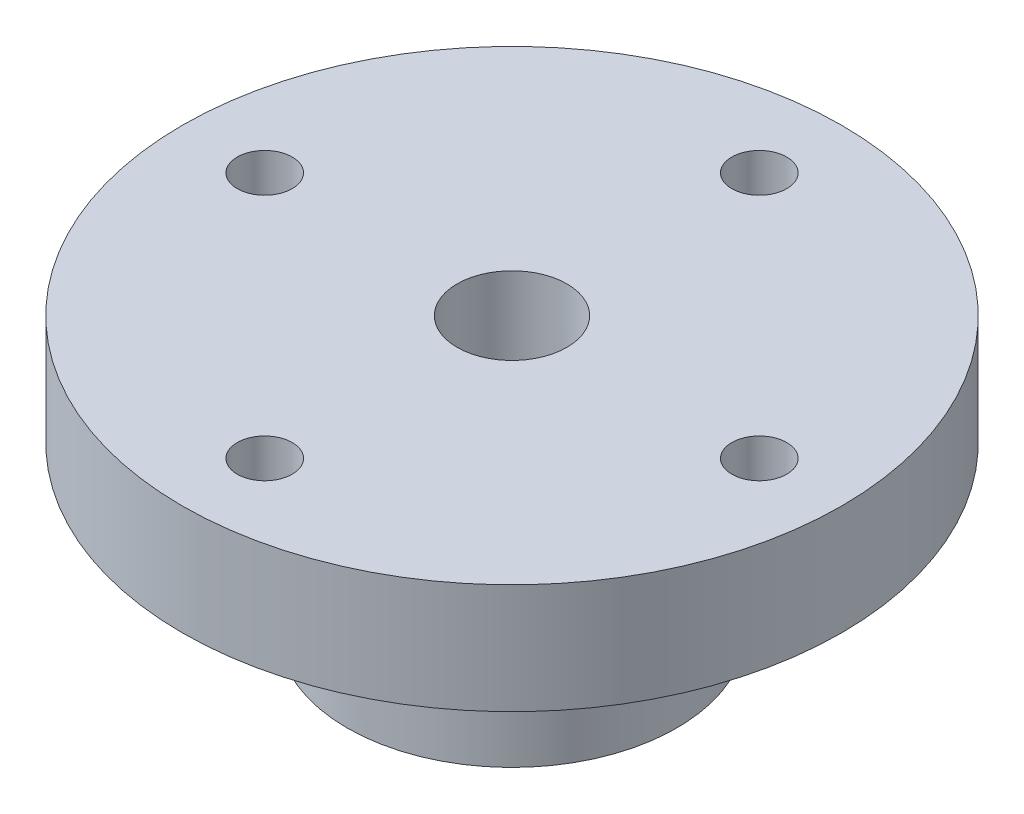
ISO-10303-21;
HEADER;
FILE_DESCRIPTION(('STEP AP214'),'2;1');
FILE_NAME('part.step','',(''),(''),'','','');
FILE_SCHEMA(('AUTOMOTIVE_DESIGN { 1 0 10303 214 1 1 1 1 }'));
ENDSEC;
DATA;
#1=APPLICATION_CONTEXT('core data for automotive mechanical design processes');
#2=APPLICATION_PROTOCOL_DEFINITION('international standard','automotive_design',2000,#1);
#3=PRODUCT_CONTEXT('',#1,'mechanical');
#4=PRODUCT('Part','Part','',(#3));
#5=PRODUCT_RELATED_PRODUCT_CATEGORY('part','',(#4));
#6=PRODUCT_DEFINITION_FORMATION('','',#4);
#7=PRODUCT_DEFINITION_CONTEXT('part definition',#1,'design');
#8=PRODUCT_DEFINITION('design','',#6,#7);
#9=PRODUCT_DEFINITION_SHAPE('','',#8);
#10=(LENGTH_UNIT() NAMED_UNIT(*) SI_UNIT(.MILLI.,.METRE.));
#11=(NAMED_UNIT(*) PLANE_ANGLE_UNIT() SI_UNIT($,.RADIAN.));
#12=(NAMED_UNIT(*) SI_UNIT($,.STERADIAN.) SOLID_ANGLE_UNIT());
#13=UNCERTAINTY_MEASURE_WITH_UNIT(LENGTH_MEASURE(1.E-05),#10,'distance_accuracy_value','');
#14=(GEOMETRIC_REPRESENTATION_CONTEXT(3) GLOBAL_UNCERTAINTY_ASSIGNED_CONTEXT((#13)) GLOBAL_UNIT_ASSIGNED_CONTEXT((#10,
#11,#12)) REPRESENTATION_CONTEXT('',''));
#15=CARTESIAN_POINT('',(0.,0.,0.));
#16=DIRECTION('',(0.,0.,1.));
#17=DIRECTION('',(1.,0.,0.));
#18=AXIS2_PLACEMENT_3D('',#15,#16,#17);
#19=CARTESIAN_POINT('',(0.,0.,0.));
#20=DIRECTION('',(0.,1.,0.));
#21=DIRECTION('',(0.,0.,1.));
#22=AXIS2_PLACEMENT_3D('',#19,#20,#21);
#23=PLANE('',#22);
#24=CARTESIAN_POINT('',(0.,0.,0.));
#25=DIRECTION('',(0.,1.,0.));
#26=DIRECTION('',(0.,0.,1.));
#27=AXIS2_PLACEMENT_3D('',#24,#25,#26);
#28=CIRCLE('',#27,30.);
#29=CARTESIAN_POINT('',(0.,0.,30.));
#30=VERTEX_POINT('',#29);
#31=EDGE_CURVE('E48',#30,#30,#28,.T.);
#32=ORIENTED_EDGE('',*,*,#31,.F.);
#33=EDGE_LOOP('',(#32));
#34=FACE_BOUND('',#33,.T.);
#35=CARTESIAN_POINT('',(0.,0.,-22.5));
#36=DIRECTION('',(0.,1.,0.));
#37=DIRECTION('',(0.,0.,1.));
#38=AXIS2_PLACEMENT_3D('',#35,#36,#37);
#39=CIRCLE('',#38,2.5);
#40=CARTESIAN_POINT('',(0.,0.,-20.));
#41=VERTEX_POINT('',#40);
#42=EDGE_CURVE('E101',#41,#41,#39,.T.);
#43=ORIENTED_EDGE('',*,*,#42,.T.);
#44=EDGE_LOOP('',(#43));
#45=FACE_BOUND('',#44,.T.);
#46=CARTESIAN_POINT('',(22.5000000000006,0.,-6.36733006886008E-13));
#47=DIRECTION('',(0.,1.,0.));
#48=DIRECTION('',(0.,0.,1.));
#49=AXIS2_PLACEMENT_3D('',#46,#47,#48);
#50=CIRCLE('',#49,2.5000000000005);
#51=CARTESIAN_POINT('',(22.5000000000006,0.,2.49999999999986));
#52=VERTEX_POINT('',#51);
#53=EDGE_CURVE('E105',#52,#52,#50,.T.);
#54=ORIENTED_EDGE('',*,*,#53,.T.);
#55=EDGE_LOOP('',(#54));
#56=FACE_BOUND('',#55,.T.);
#57=CARTESIAN_POINT('',(1.27346601377202E-12,0.,22.5));
#58=DIRECTION('',(0.,1.,0.));
#59=DIRECTION('',(0.,0.,1.));
#60=AXIS2_PLACEMENT_3D('',#57,#58,#59);
#61=CIRCLE('',#60,2.50000000000137);
#62=CARTESIAN_POINT('',(1.27346601377202E-12,0.,25.0000000000014));
#63=VERTEX_POINT('',#62);
#64=EDGE_CURVE('E109',#63,#63,#61,.T.);
#65=ORIENTED_EDGE('',*,*,#64,.T.);
#66=EDGE_LOOP('',(#65));
#67=FACE_BOUND('',#66,.T.);
#68=CARTESIAN_POINT('',(-22.4999999999994,0.,6.3948846218409E-13));
#69=DIRECTION('',(0.,1.,0.));
#70=DIRECTION('',(0.,0.,1.));
#71=AXIS2_PLACEMENT_3D('',#68,#69,#70);
#72=CIRCLE('',#71,2.50000000000102);
#73=CARTESIAN_POINT('',(-22.4999999999994,0.,2.50000000000166));
#74=VERTEX_POINT('',#73);
#75=EDGE_CURVE('E113',#74,#74,#72,.T.);
#76=ORIENTED_EDGE('',*,*,#75,.T.);
#77=EDGE_LOOP('',(#76));
#78=FACE_BOUND('',#77,.T.);
#79=CARTESIAN_POINT('',(0.,0.,0.));
#80=DIRECTION('',(0.,1.,0.));
#81=DIRECTION('',(0.,0.,1.));
#82=AXIS2_PLACEMENT_3D('',#79,#80,#81);
#83=CIRCLE('',#82,15.);
#84=CARTESIAN_POINT('',(0.,0.,15.));
#85=VERTEX_POINT('',#84);
#86=EDGE_CURVE('E10',#85,#85,#83,.F.);
#87=ORIENTED_EDGE('',*,*,#86,.F.);
#88=EDGE_LOOP('',(#87));
#89=FACE_BOUND('',#88,.T.);
#90=ADVANCED_FACE('F31',(#34,#45,#56,#67,#78,#89),#23,.F.);
#91=CARTESIAN_POINT('',(0.,10.,0.));
#92=DIRECTION('',(0.,1.,0.));
#93=DIRECTION('',(0.,0.,1.));
#94=AXIS2_PLACEMENT_3D('',#91,#92,#93);
#95=PLANE('',#94);
#96=CARTESIAN_POINT('',(-22.4999999999994,10.,6.3948846218409E-13));
#97=DIRECTION('',(0.,1.,0.));
#98=DIRECTION('',(0.,0.,1.));
#99=AXIS2_PLACEMENT_3D('',#96,#97,#98);
#100=CIRCLE('',#99,2.50000000000102);
#101=CARTESIAN_POINT('',(-22.4999999999994,10.,2.50000000000166));
#102=VERTEX_POINT('',#101);
#103=EDGE_CURVE('E116',#102,#102,#100,.T.);
#104=ORIENTED_EDGE('',*,*,#103,.F.);
#105=EDGE_LOOP('',(#104));
#106=FACE_BOUND('',#105,.T.);
#107=CARTESIAN_POINT('',(1.27346601377202E-12,10.,22.5));
#108=DIRECTION('',(0.,1.,0.));
#109=DIRECTION('',(0.,0.,1.));
#110=AXIS2_PLACEMENT_3D('',#107,#108,#109);
#111=CIRCLE('',#110,2.50000000000137);
#112=CARTESIAN_POINT('',(1.27346601377202E-12,10.,25.0000000000014));
#113=VERTEX_POINT('',#112);
#114=EDGE_CURVE('E115',#113,#113,#111,.T.);
#115=ORIENTED_EDGE('',*,*,#114,.F.);
#116=EDGE_LOOP('',(#115));
#117=FACE_BOUND('',#116,.T.);
#118=CARTESIAN_POINT('',(22.5000000000006,10.,-6.36733006886008E-13));
#119=DIRECTION('',(0.,1.,0.));
#120=DIRECTION('',(0.,0.,1.));
#121=AXIS2_PLACEMENT_3D('',#118,#119,#120);
#122=CIRCLE('',#121,2.5000000000005);
#123=CARTESIAN_POINT('',(22.5000000000006,10.,2.49999999999986));
#124=VERTEX_POINT('',#123);
#125=EDGE_CURVE('E125',#124,#124,#122,.T.);
#126=ORIENTED_EDGE('',*,*,#125,.F.);
#127=EDGE_LOOP('',(#126));
#128=FACE_BOUND('',#127,.T.);
#129=CARTESIAN_POINT('',(0.,10.,-22.5));
#130=DIRECTION('',(0.,1.,0.));
#131=DIRECTION('',(0.,0.,1.));
#132=AXIS2_PLACEMENT_3D('',#129,#130,#131);
#133=CIRCLE('',#132,2.5);
#134=CARTESIAN_POINT('',(0.,10.,-20.));
#135=VERTEX_POINT('',#134);
#136=EDGE_CURVE('E128',#135,#135,#133,.T.);
#137=ORIENTED_EDGE('',*,*,#136,.F.);
#138=EDGE_LOOP('',(#137));
#139=FACE_BOUND('',#138,.T.);
#140=CARTESIAN_POINT('',(0.,10.,0.));
#141=DIRECTION('',(0.,1.,0.));
#142=DIRECTION('',(0.,0.,1.));
#143=AXIS2_PLACEMENT_3D('',#140,#141,#142);
#144=CIRCLE('',#143,30.);
#145=CARTESIAN_POINT('',(0.,10.,30.));
#146=VERTEX_POINT('',#145);
#147=EDGE_CURVE('E43',#146,#146,#144,.T.);
#148=ORIENTED_EDGE('',*,*,#147,.T.);
#149=EDGE_LOOP('',(#148));
#150=FACE_BOUND('',#149,.T.);
#151=CARTESIAN_POINT('',(0.,10.,0.));
#152=DIRECTION('',(0.,1.,0.));
#153=DIRECTION('',(0.,0.,1.));
#154=AXIS2_PLACEMENT_3D('',#151,#152,#153);
#155=CIRCLE('',#154,5.);
#156=CARTESIAN_POINT('',(0.,10.,5.));
#157=VERTEX_POINT('',#156);
#158=EDGE_CURVE('E132',#157,#157,#155,.T.);
#159=ORIENTED_EDGE('',*,*,#158,.F.);
#160=EDGE_LOOP('',(#159));
#161=FACE_BOUND('',#160,.T.);
#162=ADVANCED_FACE('F87',(#106,#117,#128,#139,#150,#161),#95,.T.);
#163=CARTESIAN_POINT('',(0.,10.,0.));
#164=DIRECTION('',(0.,-1.,0.));
#165=DIRECTION('',(0.,0.,-1.));
#166=AXIS2_PLACEMENT_3D('',#163,#164,#165);
#167=CYLINDRICAL_SURFACE('',#166,30.);
#168=ORIENTED_EDGE('',*,*,#147,.F.);
#169=EDGE_LOOP('',(#168));
#170=FACE_BOUND('',#169,.T.);
#171=ORIENTED_EDGE('',*,*,#31,.T.);
#172=EDGE_LOOP('',(#171));
#173=FACE_BOUND('',#172,.T.);
#174=ADVANCED_FACE('F33',(#170,#173),#167,.T.);
#175=CARTESIAN_POINT('',(0.,10.,0.));
#176=DIRECTION('',(0.,-1.,0.));
#177=DIRECTION('',(0.,0.,-1.));
#178=AXIS2_PLACEMENT_3D('',#175,#176,#177);
#179=CYLINDRICAL_SURFACE('',#178,5.);
#180=CARTESIAN_POINT('',(0.,-5.,-5.));
#181=CARTESIAN_POINT('',(-0.131426682334305,-5.000009669056,-4.99999177550472));
#182=CARTESIAN_POINT('',(-0.263015634437213,-5.01042556177403,-4.99476199135277));
#183=CARTESIAN_POINT('',(-0.522301454622883,-5.05163182116205,-4.9743541856102));
#184=CARTESIAN_POINT('',(-0.649990448564105,-5.08246088092502,-4.9591572718767));
#185=CARTESIAN_POINT('',(-0.897333631316203,-5.16298462271884,-4.92040690922477));
#186=CARTESIAN_POINT('',(-1.01701694536277,-5.21260598778273,-4.89688595907259));
#187=CARTESIAN_POINT('',(-1.24618160399671,-5.32892652625179,-4.84364443325827));
#188=CARTESIAN_POINT('',(-1.3556637520377,-5.39562435314509,-4.81392434644421));
#189=CARTESIAN_POINT('',(-1.56876952630998,-5.54879313164263,-4.74890645050632));
#190=CARTESIAN_POINT('',(-1.67163802294308,-5.63621620022978,-4.71337997659091));
#191=CARTESIAN_POINT('',(-1.86194861703333,-5.82630369598529,-4.64149925776731));
#192=CARTESIAN_POINT('',(-1.94937895911555,-5.92897962884011,-4.60514440566897));
#193=CARTESIAN_POINT('',(-2.11312999967247,-6.15620837444528,-4.53247377945622));
#194=CARTESIAN_POINT('',(-2.18806333849064,-6.281840246035,-4.49637967412567));
#195=CARTESIAN_POINT('',(-2.31542056761491,-6.54591833979543,-4.43214946943555));
#196=CARTESIAN_POINT('',(-2.36786053751682,-6.68435532176262,-4.40400769020792));
#197=CARTESIAN_POINT('',(-2.44533110537653,-6.96166276359641,-4.36144667591402));
#198=CARTESIAN_POINT('',(-2.47181464267578,-7.10001113017958,-4.34630678958452));
#199=CARTESIAN_POINT('',(-2.50106748329741,-7.37994709443761,-4.3295472487215));
#200=CARTESIAN_POINT('',(-2.50386022093906,-7.52153135217509,-4.3279142335843));
#201=CARTESIAN_POINT('',(-2.48671821792512,-7.78571506079088,-4.33777325642937));
#202=CARTESIAN_POINT('',(-2.46946139884055,-7.90856007805828,-4.34771909154984));
#203=CARTESIAN_POINT('',(-2.41734962264384,-8.14930477343194,-4.37690571834675));
#204=CARTESIAN_POINT('',(-2.38248905974454,-8.26720286326311,-4.39614947079454));
#205=CARTESIAN_POINT('',(-2.29552445096459,-8.49807283141433,-4.44218691031839));
#206=CARTESIAN_POINT('',(-2.24303766778987,-8.61086599696452,-4.46914601659993));
#207=CARTESIAN_POINT('',(-2.12260421917012,-8.82658573147497,-4.52758510703513));
#208=CARTESIAN_POINT('',(-2.0546506095312,-8.92950783900021,-4.55906711950478));
#209=CARTESIAN_POINT('',(-1.89516513728194,-9.13630313185808,-4.62782894758213));
#210=CARTESIAN_POINT('',(-1.80173614592319,-9.2386421839404,-4.66533775591865));
#211=CARTESIAN_POINT('',(-1.59888894685344,-9.42683854647725,-4.73869058251019));
#212=CARTESIAN_POINT('',(-1.48946314143571,-9.5126879800847,-4.77453379897003));
#213=CARTESIAN_POINT('',(-1.25129126457962,-9.66921415257432,-4.84254968207409));
#214=CARTESIAN_POINT('',(-1.12188397899853,-9.73900118111435,-4.87447460405015));
#215=CARTESIAN_POINT('',(-0.851165538721985,-9.85524257260752,-4.92894702803109));
#216=CARTESIAN_POINT('',(-0.709863940663162,-9.9017154625379,-4.95150197358893));
#217=CARTESIAN_POINT('',(-0.431916229151781,-9.9661885092917,-4.98310834353579));
#218=CARTESIAN_POINT('',(-0.295853826370906,-9.986228089367,-4.9931234575324));
#219=CARTESIAN_POINT('',(-0.0219489998732886,-10.0036618278362,-5.00182533647794));
#220=CARTESIAN_POINT('',(0.115892549675109,-10.0010667140985,-5.00051746803426));
#221=CARTESIAN_POINT('',(0.378082429964657,-9.9744832789533,-4.98727980633468));
#222=CARTESIAN_POINT('',(0.502648520123707,-9.95216866817559,-4.97618114219992));
#223=CARTESIAN_POINT('',(0.746017230755973,-9.88940482026161,-4.94555428287529));
#224=CARTESIAN_POINT('',(0.864819214231884,-9.8489535838641,-4.92602515837625));
#225=CARTESIAN_POINT('',(1.09722152111965,-9.75000383391964,-4.87960628532329));
#226=CARTESIAN_POINT('',(1.21057599249831,-9.69102237471768,-4.85252204417873));
#227=CARTESIAN_POINT('',(1.42615340426439,-9.55723116087518,-4.7935993579975));
#228=CARTESIAN_POINT('',(1.52837157450204,-9.48241466348011,-4.76175888940534));
#229=CARTESIAN_POINT('',(1.72941922315487,-9.31059893670911,-4.69270553315087));
#230=CARTESIAN_POINT('',(1.82693019428496,-9.2121428290248,-4.65527212009488));
#231=CARTESIAN_POINT('',(2.0046408025722,-9.00018712195055,-4.58155978921587));
#232=CARTESIAN_POINT('',(2.08482846428685,-8.88667720293013,-4.54528168472407));
#233=CARTESIAN_POINT('',(2.22926978618995,-8.64089086451535,-4.4762798054528));
#234=CARTESIAN_POINT('',(2.29256373922243,-8.50797183470886,-4.44381323981254));
#235=CARTESIAN_POINT('',(2.39520706511459,-8.23122483111745,-4.38935180726746));
#236=CARTESIAN_POINT('',(2.43458729077055,-8.08741118400001,-4.36734345549014));
#237=CARTESIAN_POINT('',(2.48465421767005,-7.80772444263706,-4.33903752569351));
#238=CARTESIAN_POINT('',(2.4977324874436,-7.67241436588103,-4.33143458674096));
#239=CARTESIAN_POINT('',(2.50172288950898,-7.40138233261932,-4.32913386592579));
#240=CARTESIAN_POINT('',(2.49264462983266,-7.26566058012637,-4.3344304902511));
#241=CARTESIAN_POINT('',(2.45481530197332,-7.01129124438315,-4.35594655164663));
#242=CARTESIAN_POINT('',(2.42802074302696,-6.89224881827923,-4.37107736338133));
#243=CARTESIAN_POINT('',(2.35793843840544,-6.66047970780004,-4.40927540337602));
#244=CARTESIAN_POINT('',(2.31464538728732,-6.54775506843346,-4.43234518434965));
#245=CARTESIAN_POINT('',(2.20953919315538,-6.32343784728027,-4.48571326433413));
#246=CARTESIAN_POINT('',(2.14667719009403,-6.21243014826498,-4.5163930799845));
#247=CARTESIAN_POINT('',(2.0053780838799,-6.00181375675995,-4.58088327077455));
#248=CARTESIAN_POINT('',(1.92693287765888,-5.90221103737127,-4.61469526970767));
#249=CARTESIAN_POINT('',(1.74550556946066,-5.70464463625036,-4.68655816327011));
#250=CARTESIAN_POINT('',(1.6407002246921,-5.60835063582862,-4.7246249151498));
#251=CARTESIAN_POINT('',(1.41539785420684,-5.43434415057195,-4.79694347383545));
#252=CARTESIAN_POINT('',(1.29489242426332,-5.35664168139412,-4.83119321905446));
#253=CARTESIAN_POINT('',(1.03978808878536,-5.2219030205159,-4.89245149457782));
#254=CARTESIAN_POINT('',(0.905095560782288,-5.16501683221555,-4.91940711437488));
#255=CARTESIAN_POINT('',(0.696328709257352,-5.0978161412076,-4.95177960923351));
#256=CARTESIAN_POINT('',(0.625670413494088,-5.07844460199819,-4.96122314081874));
#257=CARTESIAN_POINT('',(0.482623997839257,-5.0459340516294,-4.97717127275101));
#258=CARTESIAN_POINT('',(0.410236963092401,-5.03279123332365,-4.98367766823159));
#259=CARTESIAN_POINT('',(0.281518684621671,-5.01526252771536,-4.9923820076613));
#260=CARTESIAN_POINT('',(0.225408499555445,-5.00954506346867,-4.99523288466454));
#261=CARTESIAN_POINT('',(0.112875528456289,-5.00191167053429,-4.99904367329659));
#262=CARTESIAN_POINT('',(0.056452733838218,-4.99999584677452,-5.00000353273198));
#263=CARTESIAN_POINT('',(0.,-5.,-5.));
#264=B_SPLINE_CURVE_WITH_KNOTS('',3,(#180,#181,#182,#183,#184,#185,#186,#187,#188,#189,#190,
#191,#192,#193,#194,#195,#196,#197,#198,#199,#200,#201,#202,#203,#204,#205,#206,#207,#208,#209,
#210,#211,#212,#213,#214,#215,#216,#217,#218,#219,#220,#221,#222,#223,#224,#225,#226,#227,#228,
#229,#230,#231,#232,#233,#234,#235,#236,#237,#238,#239,#240,#241,#242,#243,#244,#245,#246,#247,
#248,#249,#250,#251,#252,#253,#254,#255,#256,#257,#258,#259,#260,#261,#262,#263),.UNSPECIFIED.,
.T.,.F.,(4,2,2,2,2,2,2,2,2,2,2,2,2,2,2,2,2,2,2,2,2,2,2,2,2,2,2,2,2,2,2,2,2,2,2,2,2,2,2,2,2,4),
(0.,0.394060643550731,0.788870374272994,1.18215538873075,1.57540940145392,1.99245439679522,
2.40981559413509,2.85954316076882,3.30894869745702,3.73145030350574,4.15353393322551,
4.52514281023301,4.89687009814196,5.27725600421219,5.65781303150555,6.08662353334696,
6.51563836496716,6.96457555536102,7.41315542280699,7.82458226178364,8.2358141127869,
8.61517266265305,8.99457304077329,9.38482140069747,9.77523626870848,10.2039902661037,
10.6330397153795,11.0828670540368,11.53211279863,11.9382326875699,12.3441764966107,
12.7114482562151,13.0788382197025,13.4709114195009,13.8631890285845,14.303131068923,
14.7433095845248,15.1866003415819,15.407934939208,15.6291340766843,15.7983933645035,
15.9676573239323),.UNSPECIFIED.);
#265=CARTESIAN_POINT('',(0.,-5.,-5.));
#266=VERTEX_POINT('',#265);
#267=EDGE_CURVE('E75',#266,#266,#264,.T.);
#268=ORIENTED_EDGE('',*,*,#267,.F.);
#269=EDGE_LOOP('',(#268));
#270=FACE_BOUND('',#269,.T.);
#271=CARTESIAN_POINT('',(2.5,-7.5,4.33012701892219));
#272=CARTESIAN_POINT('',(2.49998948436432,-7.63026650687649,4.33013982272992));
#273=CARTESIAN_POINT('',(2.48974954513168,-7.76070272067625,4.33609541965583));
#274=CARTESIAN_POINT('',(2.44930840724943,-8.01756897152923,4.35905877051907));
#275=CARTESIAN_POINT('',(2.41906526369545,-8.14399000405729,4.37608974726023));
#276=CARTESIAN_POINT('',(2.3402497699757,-8.38862894556106,4.41873376871659));
#277=CARTESIAN_POINT('',(2.29177485369963,-8.50688657356221,4.44430111338921));
#278=CARTESIAN_POINT('',(2.17816884056414,-8.73356056309455,4.50106659111456));
#279=CARTESIAN_POINT('',(2.11303684262671,-8.84197639179579,4.53226502875883));
#280=CARTESIAN_POINT('',(1.96166634317253,-9.05576430391693,4.59992173524851));
#281=CARTESIAN_POINT('',(1.87413008816917,-9.16014783448977,4.63660159331578));
#282=CARTESIAN_POINT('',(1.68313452122751,-9.3535209757132,4.70929956727453));
#283=CARTESIAN_POINT('',(1.57966731506051,-9.44250290775495,4.74531734512768));
#284=CARTESIAN_POINT('',(1.35122390789082,-9.60841787648564,4.81553692452135));
#285=CARTESIAN_POINT('',(1.22526797235894,-9.68413441927914,4.84945266064072));
#286=CARTESIAN_POINT('',(0.960392566671145,-9.81285213348386,4.90876890230193));
#287=CARTESIAN_POINT('',(0.821481345389981,-9.8658676404385,4.93417477954535));
#288=CARTESIAN_POINT('',(0.545112359773522,-9.94376165316397,4.9720115311507));
#289=CARTESIAN_POINT('',(0.408254476210982,-9.97037381586513,4.98523700553425));
#290=CARTESIAN_POINT('',(0.131426571755676,-10.0004152967113,5.00018959613973));
#291=CARTESIAN_POINT('',(-0.00854151460650898,-10.0038586419954,5.00192366961168));
#292=CARTESIAN_POINT('',(-0.274581311061965,-9.98813331506857,4.99407454791405));
#293=CARTESIAN_POINT('',(-0.400802997942673,-9.97090496119545,4.98546239730476));
#294=CARTESIAN_POINT('',(-0.648284429795111,-9.91779789023984,4.95935613149294));
#295=CARTESIAN_POINT('',(-0.769543802734626,-9.88191777755984,4.94186135165964));
#296=CARTESIAN_POINT('',(-1.00577347892407,-9.79229358477506,4.89928958219156));
#297=CARTESIAN_POINT('',(-1.120633558788,-9.73830921706972,4.87411103823003));
#298=CARTESIAN_POINT('',(-1.33994200378327,-9.61434145949637,4.81844114966712));
#299=CARTESIAN_POINT('',(-1.4443866220966,-9.54435234174415,4.78794790393709));
#300=CARTESIAN_POINT('',(-1.6504341522455,-9.38276162116743,4.72110985998074));
#301=CARTESIAN_POINT('',(-1.75083518757341,-9.28974242918496,4.68448439995438));
#302=CARTESIAN_POINT('',(-1.93526092574445,-9.08852568767457,4.61135851467029));
#303=CARTESIAN_POINT('',(-2.01927302893558,-8.98031656931484,4.57485820664072));
#304=CARTESIAN_POINT('',(-2.17376333660553,-8.74337951893978,4.50360390231212));
#305=CARTESIAN_POINT('',(-2.24304328744513,-8.61378494236447,4.46910799976769));
#306=CARTESIAN_POINT('',(-2.35829778250308,-8.34265582160251,4.4093862569644));
#307=CARTESIAN_POINT('',(-2.40429664552722,-8.20113391745609,4.38415075115168));
#308=CARTESIAN_POINT('',(-2.4679505275626,-7.92196372179302,4.34861589542586));
#309=CARTESIAN_POINT('',(-2.48756280529994,-7.78489720239113,4.33729139621241));
#310=CARTESIAN_POINT('',(-2.50379236652857,-7.50899664620864,4.32794798404024));
#311=CARTESIAN_POINT('',(-2.50042589328757,-7.3701639272005,4.32991967223279));
#312=CARTESIAN_POINT('',(-2.47259010835991,-7.1108652035532,4.34585841351462));
#313=CARTESIAN_POINT('',(-2.45046954178116,-6.99005137223027,4.35848968766635));
#314=CARTESIAN_POINT('',(-2.38924071158112,-6.75408053432251,4.39235053878353));
#315=CARTESIAN_POINT('',(-2.35012694655908,-6.63892537313315,4.41358290012585));
#316=CARTESIAN_POINT('',(-2.25411897151217,-6.4114716727436,4.46340555199141));
#317=CARTESIAN_POINT('',(-2.19648515923162,-6.29955245786743,4.49229108107657));
#318=CARTESIAN_POINT('',(-2.0657176600397,-6.0863268211512,4.55390298743125));
#319=CARTESIAN_POINT('',(-1.99257601083123,-5.98502589121186,4.58663133387872));
#320=CARTESIAN_POINT('',(-1.82209291799636,-5.78255308119668,4.65719996140836));
#321=CARTESIAN_POINT('',(-1.72286318078435,-5.68300712322778,4.69516457885708));
#322=CARTESIAN_POINT('',(-1.5085112384988,-5.50146940499409,4.76835587444746));
#323=CARTESIAN_POINT('',(-1.39338368664988,-5.41948357434145,4.80358162519329));
#324=CARTESIAN_POINT('',(-1.14633840638507,-5.27356568520911,4.86853404227334));
#325=CARTESIAN_POINT('',(-1.01405774389062,-5.21016720479154,4.89809104179855));
#326=CARTESIAN_POINT('',(-0.738805911647332,-5.10715524003798,4.9470838739847));
#327=CARTESIAN_POINT('',(-0.595844253647067,-5.06752087039488,4.96652859191746));
#328=CARTESIAN_POINT('',(-0.317449205674705,-5.01657859064358,4.99168770453968));
#329=CARTESIAN_POINT('',(-0.182528609085376,-5.00300531416965,4.99849819767838));
#330=CARTESIAN_POINT('',(0.0878149643374312,-4.99789183250541,5.00105325940467));
#331=CARTESIAN_POINT('',(0.223237748727017,-5.00634391433891,4.99680170177042));
#332=CARTESIAN_POINT('',(0.481344982671073,-5.0435410303955,4.97834922085637));
#333=CARTESIAN_POINT('',(0.604280801321772,-5.07091217163631,4.96482236636807));
#334=CARTESIAN_POINT('',(0.843614873664455,-5.14331744975833,4.92980234191731));
#335=CARTESIAN_POINT('',(0.960012187087214,-5.18835411963363,4.90830802955518));
#336=CARTESIAN_POINT('',(1.18855854199593,-5.29681781873926,4.85814826741488));
#337=CARTESIAN_POINT('',(1.30031295715363,-5.36094902468984,4.82921542506803));
#338=CARTESIAN_POINT('',(1.51193650408535,-5.50489411014759,4.76720333344986));
#339=CARTESIAN_POINT('',(1.61180014305397,-5.58471519262687,4.73412218229104));
#340=CARTESIAN_POINT('',(1.8072854232437,-5.76699579444936,4.66321523550925));
#341=CARTESIAN_POINT('',(1.90149582349002,-5.87091772600073,4.62524489658367));
#342=CARTESIAN_POINT('',(2.07165660492503,-6.09361528538223,4.55157698284941));
#343=CARTESIAN_POINT('',(2.1475908315154,-6.21240391419923,4.51588143910584));
#344=CARTESIAN_POINT('',(2.28108393396028,-6.46663611766426,4.44998982823926));
#345=CARTESIAN_POINT('',(2.3379862797745,-6.6024873884246,4.42000320346984));
#346=CARTESIAN_POINT('',(2.40494911880459,-6.81322264951977,4.38370272660093));
#347=CARTESIAN_POINT('',(2.42419582683991,-6.88455977569761,4.37305486646054));
#348=CARTESIAN_POINT('',(2.45635087255789,-7.02904069684933,4.35507574170935));
#349=CARTESIAN_POINT('',(2.46926364179176,-7.10218319095441,4.34774215854234));
#350=CARTESIAN_POINT('',(2.48591166201423,-7.22950098654694,4.3382377954292));
#351=CARTESIAN_POINT('',(2.49118864979202,-7.2834163215122,4.33520487024791));
#352=CARTESIAN_POINT('',(2.49823512543933,-7.3915446163104,4.33114674911323));
#353=CARTESIAN_POINT('',(2.50000437866474,-7.44575759581055,4.33012168747261));
#354=CARTESIAN_POINT('',(2.5,-7.5,4.33012701892219));
#355=B_SPLINE_CURVE_WITH_KNOTS('',3,(#271,#272,#273,#274,#275,#276,#277,#278,#279,#280,#281,
#282,#283,#284,#285,#286,#287,#288,#289,#290,#291,#292,#293,#294,#295,#296,#297,#298,#299,#300,
#301,#302,#303,#304,#305,#306,#307,#308,#309,#310,#311,#312,#313,#314,#315,#316,#317,#318,#319,
#320,#321,#322,#323,#324,#325,#326,#327,#328,#329,#330,#331,#332,#333,#334,#335,#336,#337,#338,
#339,#340,#341,#342,#343,#344,#345,#346,#347,#348,#349,#350,#351,#352,#353,#354),.UNSPECIFIED.,
.T.,.F.,(4,2,2,2,2,2,2,2,2,2,2,2,2,2,2,2,2,2,2,2,2,2,2,2,2,2,2,2,2,2,2,2,2,2,2,2,2,2,2,2,2,4),
(0.,0.39058030648679,0.781982232062012,1.17132148982692,1.56068181366371,1.98215578129642,
2.40383927716011,2.85394730601992,3.30377067414811,3.72158712424921,4.13915059220183,
4.52040243716429,4.90168281298721,5.2882383683295,5.67493248380763,6.0981797864731,
6.5217512061988,6.97222104328704,7.42221935534345,7.83655727140613,8.25060232976016,
8.61935458565147,8.98822631095241,9.37418241020302,9.76033715555202,10.1951685895662,
10.6301466245059,11.076604535375,11.5226694952701,11.927806759788,12.3328021699001,
12.7111106218381,13.0894733378512,13.4840187680376,13.8787457525688,14.3127560463025,
14.7471485711797,15.195268726016,15.4189244153949,15.6424233996907,15.8050484542806,
15.9676843870379),.UNSPECIFIED.);
#356=CARTESIAN_POINT('',(2.5,-7.5,4.33012701892219));
#357=VERTEX_POINT('',#356);
#358=EDGE_CURVE('E70',#357,#357,#355,.T.);
#359=ORIENTED_EDGE('',*,*,#358,.F.);
#360=EDGE_LOOP('',(#359));
#361=FACE_BOUND('',#360,.T.);
#362=ORIENTED_EDGE('',*,*,#158,.T.);
#363=EDGE_LOOP('',(#362));
#364=FACE_BOUND('',#363,.T.);
#365=CARTESIAN_POINT('',(0.,-15.,0.));
#366=DIRECTION('',(0.,-1.,0.));
#367=DIRECTION('',(0.,0.,-1.));
#368=AXIS2_PLACEMENT_3D('',#365,#366,#367);
#369=CIRCLE('',#368,5.);
#370=CARTESIAN_POINT('',(0.,-15.,-5.));
#371=VERTEX_POINT('',#370);
#372=EDGE_CURVE('E243',#371,#371,#369,.T.);
#373=ORIENTED_EDGE('',*,*,#372,.T.);
#374=EDGE_LOOP('',(#373));
#375=FACE_BOUND('',#374,.T.);
#376=ADVANCED_FACE('F79',(#270,#361,#364,#375),#179,.F.);
#377=CARTESIAN_POINT('',(0.,0.,-22.5));
#378=DIRECTION('',(0.,1.,0.));
#379=DIRECTION('',(0.,0.,1.));
#380=AXIS2_PLACEMENT_3D('',#377,#378,#379);
#381=CYLINDRICAL_SURFACE('',#380,2.5);
#382=ORIENTED_EDGE('',*,*,#42,.F.);
#383=EDGE_LOOP('',(#382));
#384=FACE_BOUND('',#383,.T.);
#385=ORIENTED_EDGE('',*,*,#136,.T.);
#386=EDGE_LOOP('',(#385));
#387=FACE_BOUND('',#386,.T.);
#388=ADVANCED_FACE('F84',(#384,#387),#381,.F.);
#389=CARTESIAN_POINT('',(22.5000000000006,0.,-6.36733006886008E-13));
#390=DIRECTION('',(0.,1.,0.));
#391=DIRECTION('',(0.,0.,1.));
#392=AXIS2_PLACEMENT_3D('',#389,#390,#391);
#393=CYLINDRICAL_SURFACE('',#392,2.5000000000005);
#394=ORIENTED_EDGE('',*,*,#53,.F.);
#395=EDGE_LOOP('',(#394));
#396=FACE_BOUND('',#395,.T.);
#397=ORIENTED_EDGE('',*,*,#125,.T.);
#398=EDGE_LOOP('',(#397));
#399=FACE_BOUND('',#398,.T.);
#400=ADVANCED_FACE('F160',(#396,#399),#393,.F.);
#401=CARTESIAN_POINT('',(1.27346601377202E-12,0.,22.5));
#402=DIRECTION('',(0.,1.,0.));
#403=DIRECTION('',(0.,0.,1.));
#404=AXIS2_PLACEMENT_3D('',#401,#402,#403);
#405=CYLINDRICAL_SURFACE('',#404,2.50000000000137);
#406=ORIENTED_EDGE('',*,*,#64,.F.);
#407=EDGE_LOOP('',(#406));
#408=FACE_BOUND('',#407,.T.);
#409=ORIENTED_EDGE('',*,*,#114,.T.);
#410=EDGE_LOOP('',(#409));
#411=FACE_BOUND('',#410,.T.);
#412=ADVANCED_FACE('F167',(#408,#411),#405,.F.);
#413=CARTESIAN_POINT('',(-22.4999999999994,0.,6.3948846218409E-13));
#414=DIRECTION('',(0.,1.,0.));
#415=DIRECTION('',(0.,0.,1.));
#416=AXIS2_PLACEMENT_3D('',#413,#414,#415);
#417=CYLINDRICAL_SURFACE('',#416,2.50000000000102);
#418=ORIENTED_EDGE('',*,*,#75,.F.);
#419=EDGE_LOOP('',(#418));
#420=FACE_BOUND('',#419,.T.);
#421=ORIENTED_EDGE('',*,*,#103,.T.);
#422=EDGE_LOOP('',(#421));
#423=FACE_BOUND('',#422,.T.);
#424=ADVANCED_FACE('F174',(#420,#423),#417,.F.);
#425=CARTESIAN_POINT('',(0.,-15.,0.));
#426=DIRECTION('',(0.,-1.,0.));
#427=DIRECTION('',(0.,0.,-1.));
#428=AXIS2_PLACEMENT_3D('',#425,#426,#427);
#429=PLANE('',#428);
#430=CARTESIAN_POINT('',(0.,-15.,0.));
#431=DIRECTION('',(0.,-1.,0.));
#432=DIRECTION('',(0.,0.,-1.));
#433=AXIS2_PLACEMENT_3D('',#430,#431,#432);
#434=CIRCLE('',#433,15.);
#435=CARTESIAN_POINT('',(0.,-15.,-15.));
#436=VERTEX_POINT('',#435);
#437=EDGE_CURVE('E121',#436,#436,#434,.T.);
#438=ORIENTED_EDGE('',*,*,#437,.T.);
#439=EDGE_LOOP('',(#438));
#440=FACE_BOUND('',#439,.T.);
#441=ORIENTED_EDGE('',*,*,#372,.F.);
#442=EDGE_LOOP('',(#441));
#443=FACE_BOUND('',#442,.T.);
#444=ADVANCED_FACE('F64',(#440,#443),#429,.T.);
#445=CARTESIAN_POINT('',(0.,-15.,0.));
#446=DIRECTION('',(0.,1.,0.));
#447=DIRECTION('',(0.,0.,1.));
#448=AXIS2_PLACEMENT_3D('',#445,#446,#447);
#449=CYLINDRICAL_SURFACE('',#448,15.);
#450=CARTESIAN_POINT('',(0.,-10.,15.));
#451=CARTESIAN_POINT('',(-0.139390904958215,-9.99999441105218,14.9999976116882));
#452=CARTESIAN_POINT('',(-0.278857881838821,-9.98830272503108,14.9980367791303));
#453=CARTESIAN_POINT('',(-0.553880221673043,-9.94186434123467,14.9904034494139));
#454=CARTESIAN_POINT('',(-0.689431867959247,-9.9070964430884,14.9847275392389));
#455=CARTESIAN_POINT('',(-0.952604747212644,-9.81558455140724,14.9703006823645));
#456=CARTESIAN_POINT('',(-1.0802323684319,-9.75885853435942,14.9615522515919));
#457=CARTESIAN_POINT('',(-1.32414184197794,-9.6250877079476,14.9419422708207));
#458=CARTESIAN_POINT('',(-1.44042498987859,-9.548045222517,14.9310809625443));
#459=CARTESIAN_POINT('',(-1.65947261429168,-9.37504491617954,14.9083331745831));
#460=CARTESIAN_POINT('',(-1.76211290353497,-9.27893088536387,14.8964387181486));
#461=CARTESIAN_POINT('',(-1.94988849865993,-9.07085203152719,14.8730262687673));
#462=CARTESIAN_POINT('',(-2.03502269939097,-8.95888620854339,14.8615082996267));
#463=CARTESIAN_POINT('',(-2.18586712560513,-8.72142903380294,14.8400756575978));
#464=CARTESIAN_POINT('',(-2.251454552861,-8.59585866319524,14.8301712909164));
#465=CARTESIAN_POINT('',(-2.36055836541122,-8.33529043569937,14.8131978979467));
#466=CARTESIAN_POINT('',(-2.40407624156561,-8.20029321632236,14.8061286801431));
#467=CARTESIAN_POINT('',(-2.46741437778481,-7.92601972514346,14.7957053684276));
#468=CARTESIAN_POINT('',(-2.4874490291354,-7.78679426349861,14.792317684857));
#469=CARTESIAN_POINT('',(-2.50391672528988,-7.50691972311653,14.7895393893665));
#470=CARTESIAN_POINT('',(-2.500351440389,-7.3662707458327,14.7901484945721));
#471=CARTESIAN_POINT('',(-2.46989509839615,-7.08907213872455,14.7952642886355));
#472=CARTESIAN_POINT('',(-2.44324488188977,-6.95249519645476,14.7997307331892));
#473=CARTESIAN_POINT('',(-2.36775314040345,-6.68577868217086,14.8119949521101));
#474=CARTESIAN_POINT('',(-2.31891085431974,-6.55563933111145,14.8197928407327));
#475=CARTESIAN_POINT('',(-2.20017724609391,-6.30477117655908,14.837884793341));
#476=CARTESIAN_POINT('',(-2.13018591387971,-6.18409059391877,14.8481906710733));
#477=CARTESIAN_POINT('',(-1.97121201755743,-5.95609559946161,14.8701291841501));
#478=CARTESIAN_POINT('',(-1.88222792065429,-5.84878226754507,14.8817619265429));
#479=CARTESIAN_POINT('',(-1.68648221215905,-5.64917391419265,14.9052202787979));
#480=CARTESIAN_POINT('',(-1.57951396387313,-5.55708148145992,14.9170464923165));
#481=CARTESIAN_POINT('',(-1.35153524898165,-5.39212223733466,14.9394260139672));
#482=CARTESIAN_POINT('',(-1.23052469190642,-5.31925554981677,14.9499793138975));
#483=CARTESIAN_POINT('',(-0.977705916166712,-5.19479777286371,14.9686389289291));
#484=CARTESIAN_POINT('',(-0.845888725564662,-5.14322458066874,14.9767431840745));
#485=CARTESIAN_POINT('',(-0.575298345602731,-5.06300578475402,14.9895750301266));
#486=CARTESIAN_POINT('',(-0.436525739179468,-5.03435826302628,14.9943029035047));
#487=CARTESIAN_POINT('',(-0.157709901301624,-5.00107864153886,14.9998112984269));
#488=CARTESIAN_POINT('',(-0.0177007371510114,-4.99616842819439,15.0006375301278));
#489=CARTESIAN_POINT('',(0.261139772889887,-5.00976134442812,14.9983747442117));
#490=CARTESIAN_POINT('',(0.399971163892039,-5.02826357313373,14.9952858772412));
#491=CARTESIAN_POINT('',(0.671656175546763,-5.08792484933547,14.985568269382));
#492=CARTESIAN_POINT('',(0.804540868385379,-5.12894620839012,14.9789610480131));
#493=CARTESIAN_POINT('',(1.06154688486044,-5.23233451819953,14.9629446445536));
#494=CARTESIAN_POINT('',(1.18566771590972,-5.29470266763527,14.9535353051202));
#495=CARTESIAN_POINT('',(1.42283068946896,-5.43965112469678,14.9328451630241));
#496=CARTESIAN_POINT('',(1.53576525093715,-5.52240515616725,14.9215485588702));
#497=CARTESIAN_POINT('',(1.74624358550269,-5.70553731538506,14.898384673919));
#498=CARTESIAN_POINT('',(1.84378623969658,-5.80591672327667,14.8865173517155));
#499=CARTESIAN_POINT('',(2.021742779658,-6.02269754807142,14.8634017523585));
#500=CARTESIAN_POINT('',(2.10196876111372,-6.13925416551441,14.8521611613711));
#501=CARTESIAN_POINT('',(2.24170231029499,-6.38435296913854,14.8317152977788));
#502=CARTESIAN_POINT('',(2.30121053476982,-6.51289477522749,14.8225099606602));
#503=CARTESIAN_POINT('',(2.39753833147315,-6.77778973281213,14.807234536977));
#504=CARTESIAN_POINT('',(2.43445143254795,-6.91410809503049,14.8011515431106));
#505=CARTESIAN_POINT('',(2.48483545377828,-7.19112012922176,14.7927771683526));
#506=CARTESIAN_POINT('',(2.49830841194617,-7.33181341973205,14.7904854578272));
#507=CARTESIAN_POINT('',(2.50137286604735,-7.61170516596241,14.7899673308401));
#508=CARTESIAN_POINT('',(2.49126013612519,-7.75090037857529,14.7916905650565));
#509=CARTESIAN_POINT('',(2.44807983895685,-8.02557924805076,14.7988978145373));
#510=CARTESIAN_POINT('',(2.41501234611248,-8.16106291694187,14.8043818176121));
#511=CARTESIAN_POINT('',(2.3269744895949,-8.42435843729261,14.8184735628172));
#512=CARTESIAN_POINT('',(2.27202959060044,-8.55217901005602,14.8270776721967));
#513=CARTESIAN_POINT('',(2.14182700391591,-8.79683566919485,14.8464436892221));
#514=CARTESIAN_POINT('',(2.06656830874856,-8.91367121037213,14.857205703884));
#515=CARTESIAN_POINT('',(1.89681888437215,-9.13453558310775,14.8798345404562));
#516=CARTESIAN_POINT('',(1.80211056359365,-9.23839601670027,14.891712955763));
#517=CARTESIAN_POINT('',(1.59660903138023,-9.42885160447494,14.9151437236084));
#518=CARTESIAN_POINT('',(1.48581211291263,-9.51544276863817,14.9266960002655));
#519=CARTESIAN_POINT('',(1.25036916964028,-9.66944826819994,14.9482652964222));
#520=CARTESIAN_POINT('',(1.12563278753282,-9.73672603931295,14.958271162531));
#521=CARTESIAN_POINT('',(0.866513069378981,-9.84926948460992,14.9755116760178));
#522=CARTESIAN_POINT('',(0.732139494830009,-9.8945570810797,14.9827490817748));
#523=CARTESIAN_POINT('',(0.4977033100454,-9.95200527412666,14.9920579083296));
#524=CARTESIAN_POINT('',(0.399058830298447,-9.96997446961596,14.9950202727336));
#525=CARTESIAN_POINT('',(0.200289310319809,-9.99397373784475,14.9989921598612));
#526=CARTESIAN_POINT('',(0.100164295608494,-10.0000040161374,15.0000017162064));
#527=CARTESIAN_POINT('',(0.,-10.,15.));
#528=B_SPLINE_CURVE_WITH_KNOTS('',3,(#450,#451,#452,#453,#454,#455,#456,#457,#458,#459,#460,
#461,#462,#463,#464,#465,#466,#467,#468,#469,#470,#471,#472,#473,#474,#475,#476,#477,#478,#479,
#480,#481,#482,#483,#484,#485,#486,#487,#488,#489,#490,#491,#492,#493,#494,#495,#496,#497,#498,
#499,#500,#501,#502,#503,#504,#505,#506,#507,#508,#509,#510,#511,#512,#513,#514,#515,#516,#517,
#518,#519,#520,#521,#522,#523,#524,#525,#526,#527),.UNSPECIFIED.,.T.,.F.,(4,2,2,2,2,2,2,2,2,2,2,
2,2,2,2,2,2,2,2,2,2,2,2,2,2,2,2,2,2,2,2,2,2,2,2,2,2,2,4),(0.,0.41780658493851,0.835997545695421,
1.25384686702527,1.67164841267479,2.09302491062332,2.51442800169857,2.9384252082384,
3.36239376876181,3.78246077103424,4.20249804320886,4.61820521760409,5.03392665025381,
5.45164556632558,5.86939820680574,6.29232769911327,6.71525991635848,7.13854688915903,
7.56179844521149,7.98007883491397,8.3983431303586,8.81407807006415,9.22983635826066,
9.64926825627024,10.0687306305428,10.4925382200762,10.9163323737594,11.3383602234177,
11.7603513778662,12.177079095227,12.5938054618813,13.0100481822622,13.4263115502934,
13.8475138419339,14.2688133387897,14.693022316072,15.1168075213007,15.4170424816402,
15.7172722727697),.UNSPECIFIED.);
#529=CARTESIAN_POINT('',(0.,-10.,15.));
#530=VERTEX_POINT('',#529);
#531=EDGE_CURVE('E35',#530,#530,#528,.T.);
#532=ORIENTED_EDGE('',*,*,#531,.T.);
#533=EDGE_LOOP('',(#532));
#534=FACE_BOUND('',#533,.T.);
#535=CARTESIAN_POINT('',(2.5,-7.5,-14.790199457749));
#536=CARTESIAN_POINT('',(2.49999439841983,-7.36062425183819,-14.790201973666));
#537=CARTESIAN_POINT('',(2.48830516902828,-7.22117239392853,-14.7921909238523));
#538=CARTESIAN_POINT('',(2.44187742806638,-6.94618145673683,-14.7999245720004));
#539=CARTESIAN_POINT('',(2.40711766030861,-6.81064610624193,-14.8056727334637));
#540=CARTESIAN_POINT('',(2.31562954367049,-6.54750771665839,-14.8202560936731));
#541=CARTESIAN_POINT('',(2.25891955493199,-6.41989815133775,-14.8290887118401));
#542=CARTESIAN_POINT('',(2.12518649688947,-6.17601904528222,-14.8488427210228));
#543=CARTESIAN_POINT('',(2.04816571350133,-6.05974823042267,-14.8597638769423));
#544=CARTESIAN_POINT('',(1.87518752696654,-5.84068715025543,-14.8825847115588));
#545=CARTESIAN_POINT('',(1.77906904893234,-5.73802486861378,-14.8944921732795));
#546=CARTESIAN_POINT('',(1.57097200469527,-5.55020669313819,-14.9178748066858));
#547=CARTESIAN_POINT('',(1.45899249914997,-5.46505183688458,-14.9293499527174));
#548=CARTESIAN_POINT('',(1.22152286994836,-5.31418543278072,-14.9506573698271));
#549=CARTESIAN_POINT('',(1.09595608145671,-5.24859299226819,-14.9604794243234));
#550=CARTESIAN_POINT('',(0.835395621723868,-5.13947892946944,-14.9772873695709));
#551=CARTESIAN_POINT('',(0.700402564078188,-5.09595587211512,-14.9842734447266));
#552=CARTESIAN_POINT('',(0.426143726344242,-5.0326074650161,-14.994567347244));
#553=CARTESIAN_POINT('',(0.286928886679271,-5.0125670839953,-14.9979085311091));
#554=CARTESIAN_POINT('',(0.00707528552579717,-4.9960842458474,-15.0006507934278));
#555=CARTESIAN_POINT('',(-0.133563378528898,-4.99964018475276,-15.0000521396931));
#556=CARTESIAN_POINT('',(-0.410802185078876,-5.03008135152821,-14.9950085843139));
#557=CARTESIAN_POINT('',(-0.547428530700141,-5.05673516340915,-14.990601836924));
#558=CARTESIAN_POINT('',(-0.814241979611791,-5.13225107424649,-14.9784797877164));
#559=CARTESIAN_POINT('',(-0.944428886651504,-5.1811138495895,-14.9707643851321));
#560=CARTESIAN_POINT('',(-1.19535614778265,-5.29989064031532,-14.9528269851196));
#561=CARTESIAN_POINT('',(-1.31605052301904,-5.36990001208244,-14.9425936732688));
#562=CARTESIAN_POINT('',(-1.54406552984664,-5.52891282263505,-14.920757380715));
#563=CARTESIAN_POINT('',(-1.65138507791588,-5.61791779871081,-14.9091542891913));
#564=CARTESIAN_POINT('',(-1.85097127344667,-5.8136788066193,-14.885702682326));
#565=CARTESIAN_POINT('',(-1.94303950225321,-5.92063709490098,-14.8738528973104));
#566=CARTESIAN_POINT('',(-2.10795458844806,-6.14858709021582,-14.8513795978481));
#567=CARTESIAN_POINT('',(-2.18080126853242,-6.26957892668282,-14.8407560947132));
#568=CARTESIAN_POINT('',(-2.30524443448829,-6.52239164187748,-14.8219375456182));
#569=CARTESIAN_POINT('',(-2.35681702727924,-6.65422449809209,-14.813745233026));
#570=CARTESIAN_POINT('',(-2.43702987081562,-6.92484907230754,-14.8007618868988));
#571=CARTESIAN_POINT('',(-2.46567214076796,-7.06364017643242,-14.7959705538832));
#572=CARTESIAN_POINT('',(-2.49893188487927,-7.34246615616213,-14.7903895942212));
#573=CARTESIAN_POINT('',(-2.50383220791244,-7.4824663797021,-14.7895528575867));
#574=CARTESIAN_POINT('',(-2.49022270268246,-7.76128667169082,-14.7918503478236));
#575=CARTESIAN_POINT('',(-2.47171377862467,-7.90010678551397,-14.7949844213185));
#576=CARTESIAN_POINT('',(-2.4120523349281,-8.17172775919086,-14.8048268745502));
#577=CARTESIAN_POINT('',(-2.37104379064639,-8.30456113987801,-14.8115125191835));
#578=CARTESIAN_POINT('',(-2.26769819019228,-8.56147016627948,-14.827685730055));
#579=CARTESIAN_POINT('',(-2.20535985810094,-8.6855452875509,-14.8371734639058));
#580=CARTESIAN_POINT('',(-2.06045667322923,-8.92267459440611,-14.8579912839739));
#581=CARTESIAN_POINT('',(-1.97771056415936,-9.03561657275606,-14.8693375560035));
#582=CARTESIAN_POINT('',(-1.79458946570798,-9.246113532695,-14.8925466667987));
#583=CARTESIAN_POINT('',(-1.69421323638404,-9.34366743110974,-14.9044095418533));
#584=CARTESIAN_POINT('',(-1.47742807032881,-9.5216518927287,-14.9274642211826));
#585=CARTESIAN_POINT('',(-1.3608632533862,-9.60189382628454,-14.9386477634467));
#586=CARTESIAN_POINT('',(-1.11574344794933,-9.74165532700488,-14.9589511243294));
#587=CARTESIAN_POINT('',(-0.987188847470626,-9.80117556447385,-14.9680710096998));
#588=CARTESIAN_POINT('',(-0.722299051501328,-9.89751058395486,-14.9831835816958));
#589=CARTESIAN_POINT('',(-0.586000562602612,-9.93442407573492,-14.9891898456762));
#590=CARTESIAN_POINT('',(-0.309030734874212,-9.98481559896383,-14.9974558316928));
#591=CARTESIAN_POINT('',(-0.168359756821621,-9.99829555873235,-14.9997158620019));
#592=CARTESIAN_POINT('',(0.111541275773676,-10.0013818823122,-15.0002303788781));
#593=CARTESIAN_POINT('',(0.250768160602665,-9.99127525394108,-14.9985330202419));
#594=CARTESIAN_POINT('',(0.525511974314705,-9.94809607773057,-14.9914217838733));
#595=CARTESIAN_POINT('',(0.661028923967479,-9.91502365849033,-14.9860079269518));
#596=CARTESIAN_POINT('',(0.924396445918537,-9.82696183445635,-14.972069888274));
#597=CARTESIAN_POINT('',(1.05225537215382,-9.77199683178995,-14.9635491704088));
#598=CARTESIAN_POINT('',(1.29698045298217,-9.64174206376942,-14.9443275687803));
#599=CARTESIAN_POINT('',(1.41384608611822,-9.56645133493755,-14.9336265816741));
#600=CARTESIAN_POINT('',(1.6347129455264,-9.3966649075395,-14.9110762961641));
#601=CARTESIAN_POINT('',(1.73855143060275,-9.30195904524874,-14.8992152454112));
#602=CARTESIAN_POINT('',(1.92896387595091,-9.09647169209618,-14.8757630331437));
#603=CARTESIAN_POINT('',(2.0155337867119,-8.98568644108747,-14.8641719354951));
#604=CARTESIAN_POINT('',(2.16951427091086,-8.75025467751038,-14.8424834353391));
#605=CARTESIAN_POINT('',(2.2367849890577,-8.62551566023451,-14.8323971784578));
#606=CARTESIAN_POINT('',(2.34931453640427,-8.36639076416185,-14.8149921009131));
#607=CARTESIAN_POINT('',(2.39459535522307,-8.23201467732263,-14.8076705172488));
#608=CARTESIAN_POINT('',(2.45202605312742,-7.99759623051261,-14.7982474485649));
#609=CARTESIAN_POINT('',(2.46998741767139,-7.89897319203739,-14.7952462341947));
#610=CARTESIAN_POINT('',(2.49397629518131,-7.70024651516306,-14.7912213528807));
#611=CARTESIAN_POINT('',(2.50000402479277,-7.6001429036758,-14.7901976500369));
#612=CARTESIAN_POINT('',(2.5,-7.5,-14.790199457749));
#613=B_SPLINE_CURVE_WITH_KNOTS('',3,(#535,#536,#537,#538,#539,#540,#541,#542,#543,#544,#545,
#546,#547,#548,#549,#550,#551,#552,#553,#554,#555,#556,#557,#558,#559,#560,#561,#562,#563,#564,
#565,#566,#567,#568,#569,#570,#571,#572,#573,#574,#575,#576,#577,#578,#579,#580,#581,#582,#583,
#584,#585,#586,#587,#588,#589,#590,#591,#592,#593,#594,#595,#596,#597,#598,#599,#600,#601,#602,
#603,#604,#605,#606,#607,#608,#609,#610,#611,#612),.UNSPECIFIED.,.T.,.F.,(4,2,2,2,2,2,2,2,2,2,2,
2,2,2,2,2,2,2,2,2,2,2,2,2,2,2,2,2,2,2,2,2,2,2,2,2,2,2,4),(0.,0.41776103892774,0.83590751996297,
1.25370499787519,1.67145547405274,2.09289159155715,2.51435267834447,2.93832980111435,
3.36227935111113,3.78231567472565,4.20232344652692,4.61817121164668,5.03403164249533,
5.45179604139425,5.86959426226764,6.29246123462123,6.71533210746019,7.13867662498604,
7.56198385938077,7.98023542420411,8.39847083413976,8.81406064635492,9.22967532293574,
9.64912342762702,10.0686010443069,10.4924411303538,10.916267504767,11.3382298441765,
11.7601574591235,12.1769777626592,12.5937957321882,13.0101503983246,13.4265248039234,
13.8476699746325,14.2689137888181,14.6931372761832,15.1169356674445,15.4171067054376,
15.7172722940182),.UNSPECIFIED.);
#614=CARTESIAN_POINT('',(2.5,-7.5,-14.790199457749));
#615=VERTEX_POINT('',#614);
#616=EDGE_CURVE('E51',#615,#615,#613,.T.);
#617=ORIENTED_EDGE('',*,*,#616,.T.);
#618=EDGE_LOOP('',(#617));
#619=FACE_BOUND('',#618,.T.);
#620=ORIENTED_EDGE('',*,*,#437,.F.);
#621=EDGE_LOOP('',(#620));
#622=FACE_BOUND('',#621,.T.);
#623=ORIENTED_EDGE('',*,*,#86,.T.);
#624=EDGE_LOOP('',(#623));
#625=FACE_BOUND('',#624,.T.);
#626=ADVANCED_FACE('F55',(#534,#619,#622,#625),#449,.T.);
#627=CARTESIAN_POINT('',(0.,-7.5,-39.));
#628=DIRECTION('',(0.,0.,1.));
#629=DIRECTION('',(1.,0.,0.));
#630=AXIS2_PLACEMENT_3D('',#627,#628,#629);
#631=CYLINDRICAL_SURFACE('',#630,2.5);
#632=ORIENTED_EDGE('',*,*,#267,.T.);
#633=EDGE_LOOP('',(#632));
#634=FACE_BOUND('',#633,.T.);
#635=ORIENTED_EDGE('',*,*,#616,.F.);
#636=EDGE_LOOP('',(#635));
#637=FACE_BOUND('',#636,.T.);
#638=ADVANCED_FACE('F59',(#634,#637),#631,.F.);
#639=ORIENTED_EDGE('',*,*,#358,.T.);
#640=EDGE_LOOP('',(#639));
#641=FACE_BOUND('',#640,.T.);
#642=ORIENTED_EDGE('',*,*,#531,.F.);
#643=EDGE_LOOP('',(#642));
#644=FACE_BOUND('',#643,.T.);
#645=ADVANCED_FACE('F62',(#641,#644),#631,.F.);
#646=CLOSED_SHELL('',(#90,#162,#174,#376,#388,#400,#412,#424,#444,#626,#638,#645));
#647=MANIFOLD_SOLID_BREP('B2',#646);
#648=ADVANCED_BREP_SHAPE_REPRESENTATION('',(#18,#647),#14);
#649=SHAPE_DEFINITION_REPRESENTATION(#9,#648);
ENDSEC;
END-ISO-10303-21;
